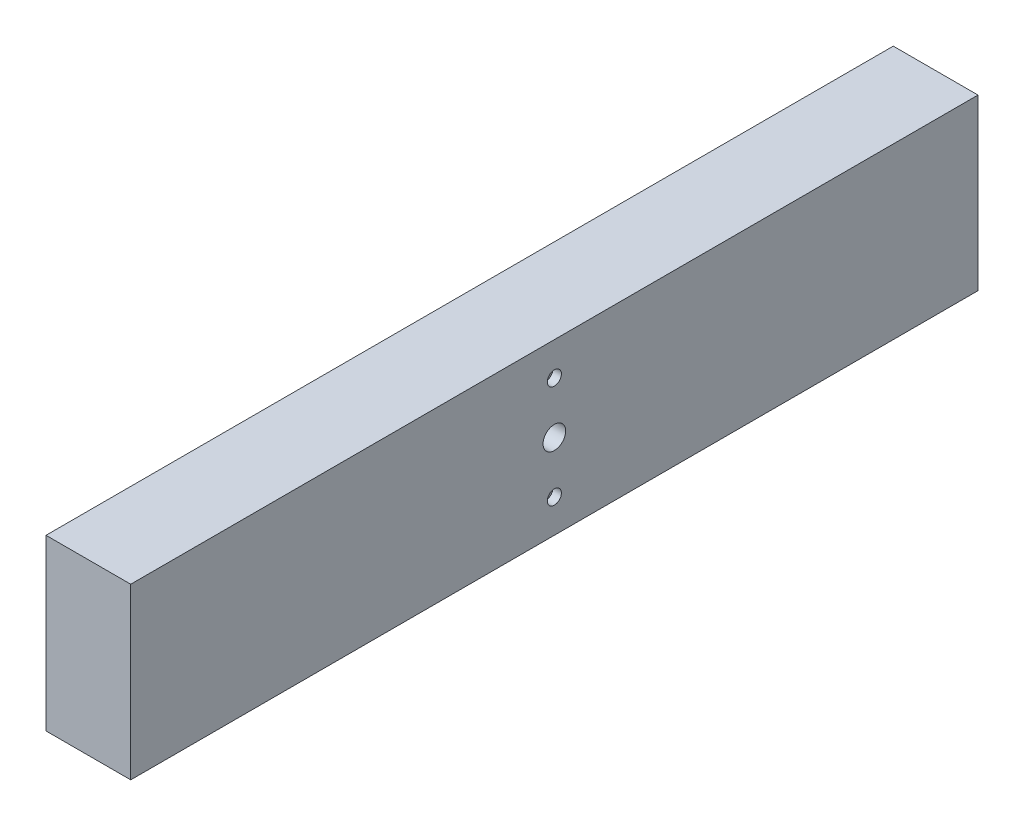
ISO-10303-21;
HEADER;
FILE_DESCRIPTION(('STEP AP214'),'2;1');
FILE_NAME('part.step','',(''),(''),'','','');
FILE_SCHEMA(('AUTOMOTIVE_DESIGN { 1 0 10303 214 1 1 1 1 }'));
ENDSEC;
DATA;
#1=APPLICATION_CONTEXT('core data for automotive mechanical design processes');
#2=APPLICATION_PROTOCOL_DEFINITION('international standard','automotive_design',2000,#1);
#3=PRODUCT_CONTEXT('',#1,'mechanical');
#4=PRODUCT('Part','Part','',(#3));
#5=PRODUCT_RELATED_PRODUCT_CATEGORY('part','',(#4));
#6=PRODUCT_DEFINITION_FORMATION('','',#4);
#7=PRODUCT_DEFINITION_CONTEXT('part definition',#1,'design');
#8=PRODUCT_DEFINITION('design','',#6,#7);
#9=PRODUCT_DEFINITION_SHAPE('','',#8);
#10=(LENGTH_UNIT() NAMED_UNIT(*) SI_UNIT(.MILLI.,.METRE.));
#11=(NAMED_UNIT(*) PLANE_ANGLE_UNIT() SI_UNIT($,.RADIAN.));
#12=(NAMED_UNIT(*) SI_UNIT($,.STERADIAN.) SOLID_ANGLE_UNIT());
#13=UNCERTAINTY_MEASURE_WITH_UNIT(LENGTH_MEASURE(1.E-05),#10,'distance_accuracy_value','');
#14=(GEOMETRIC_REPRESENTATION_CONTEXT(3) GLOBAL_UNCERTAINTY_ASSIGNED_CONTEXT((#13)) GLOBAL_UNIT_ASSIGNED_CONTEXT((#10,
#11,#12)) REPRESENTATION_CONTEXT('',''));
#15=CARTESIAN_POINT('',(0.,0.,0.));
#16=DIRECTION('',(0.,0.,1.));
#17=DIRECTION('',(1.,0.,0.));
#18=AXIS2_PLACEMENT_3D('',#15,#16,#17);
#19=CARTESIAN_POINT('',(15.,-30.,-150.));
#20=DIRECTION('',(1.,0.,0.));
#21=DIRECTION('',(0.,0.,-1.));
#22=AXIS2_PLACEMENT_3D('',#19,#20,#21);
#23=PLANE('',#22);
#24=CARTESIAN_POINT('',(15.,0.,0.));
#25=DIRECTION('',(1.,0.,0.));
#26=DIRECTION('',(0.,0.,-1.));
#27=AXIS2_PLACEMENT_3D('',#24,#25,#26);
#28=CIRCLE('',#27,3.99999999999999);
#29=CARTESIAN_POINT('',(15.,0.,-3.99999999999999));
#30=VERTEX_POINT('',#29);
#31=EDGE_CURVE('E151',#30,#30,#28,.T.);
#32=ORIENTED_EDGE('',*,*,#31,.F.);
#33=EDGE_LOOP('',(#32));
#34=FACE_BOUND('',#33,.T.);
#35=CARTESIAN_POINT('',(15.,18.25,0.));
#36=DIRECTION('',(1.,0.,0.));
#37=DIRECTION('',(0.,0.,-1.));
#38=AXIS2_PLACEMENT_3D('',#35,#36,#37);
#39=CIRCLE('',#38,2.5);
#40=CARTESIAN_POINT('',(15.,18.25,-2.5));
#41=VERTEX_POINT('',#40);
#42=EDGE_CURVE('E105',#41,#41,#39,.T.);
#43=ORIENTED_EDGE('',*,*,#42,.F.);
#44=EDGE_LOOP('',(#43));
#45=FACE_BOUND('',#44,.T.);
#46=CARTESIAN_POINT('',(15.,-18.25,0.));
#47=DIRECTION('',(1.,0.,0.));
#48=DIRECTION('',(0.,0.,1.));
#49=AXIS2_PLACEMENT_3D('',#46,#47,#48);
#50=CIRCLE('',#49,2.5);
#51=CARTESIAN_POINT('',(15.,-18.25,2.5));
#52=VERTEX_POINT('',#51);
#53=EDGE_CURVE('E108',#52,#52,#50,.T.);
#54=ORIENTED_EDGE('',*,*,#53,.F.);
#55=EDGE_LOOP('',(#54));
#56=FACE_BOUND('',#55,.T.);
#57=DIRECTION('',(0.,0.,1.));
#58=VECTOR('',#57,1.);
#59=CARTESIAN_POINT('',(15.,30.,-150.));
#60=LINE('',#59,#58);
#61=CARTESIAN_POINT('',(15.,30.,-150.));
#62=VERTEX_POINT('',#61);
#63=CARTESIAN_POINT('',(15.,30.,150.));
#64=VERTEX_POINT('',#63);
#65=EDGE_CURVE('E42',#62,#64,#60,.T.);
#66=ORIENTED_EDGE('',*,*,#65,.T.);
#67=DIRECTION('',(0.,1.,0.));
#68=VECTOR('',#67,1.);
#69=CARTESIAN_POINT('',(15.,-30.,150.));
#70=LINE('',#69,#68);
#71=CARTESIAN_POINT('',(15.,-30.,150.));
#72=VERTEX_POINT('',#71);
#73=EDGE_CURVE('E80',#72,#64,#70,.T.);
#74=ORIENTED_EDGE('',*,*,#73,.F.);
#75=DIRECTION('',(0.,0.,1.));
#76=VECTOR('',#75,1.);
#77=CARTESIAN_POINT('',(15.,-30.,-150.));
#78=LINE('',#77,#76);
#79=CARTESIAN_POINT('',(15.,-30.,-150.));
#80=VERTEX_POINT('',#79);
#81=EDGE_CURVE('E11',#80,#72,#78,.T.);
#82=ORIENTED_EDGE('',*,*,#81,.F.);
#83=DIRECTION('',(0.,1.,0.));
#84=VECTOR('',#83,1.);
#85=CARTESIAN_POINT('',(15.,-30.,-150.));
#86=LINE('',#85,#84);
#87=EDGE_CURVE('E81',#80,#62,#86,.T.);
#88=ORIENTED_EDGE('',*,*,#87,.T.);
#89=EDGE_LOOP('',(#66,#74,#82,#88));
#90=FACE_BOUND('',#89,.T.);
#91=ADVANCED_FACE('F39',(#34,#45,#56,#90),#23,.T.);
#92=CARTESIAN_POINT('',(-15.,-30.,-150.));
#93=DIRECTION('',(0.,-1.,0.));
#94=DIRECTION('',(0.,0.,-1.));
#95=AXIS2_PLACEMENT_3D('',#92,#93,#94);
#96=PLANE('',#95);
#97=ORIENTED_EDGE('',*,*,#81,.T.);
#98=DIRECTION('',(1.,0.,0.));
#99=VECTOR('',#98,1.);
#100=CARTESIAN_POINT('',(-15.,-30.,150.));
#101=LINE('',#100,#99);
#102=CARTESIAN_POINT('',(-15.,-30.,150.));
#103=VERTEX_POINT('',#102);
#104=EDGE_CURVE('E99',#103,#72,#101,.T.);
#105=ORIENTED_EDGE('',*,*,#104,.F.);
#106=DIRECTION('',(0.,0.,1.));
#107=VECTOR('',#106,1.);
#108=CARTESIAN_POINT('',(-15.,-30.,-150.));
#109=LINE('',#108,#107);
#110=CARTESIAN_POINT('',(-15.,-30.,-150.));
#111=VERTEX_POINT('',#110);
#112=EDGE_CURVE('E48',#111,#103,#109,.T.);
#113=ORIENTED_EDGE('',*,*,#112,.F.);
#114=DIRECTION('',(1.,0.,0.));
#115=VECTOR('',#114,1.);
#116=CARTESIAN_POINT('',(-15.,-30.,-150.));
#117=LINE('',#116,#115);
#118=EDGE_CURVE('E87',#111,#80,#117,.T.);
#119=ORIENTED_EDGE('',*,*,#118,.T.);
#120=EDGE_LOOP('',(#97,#105,#113,#119));
#121=FACE_BOUND('',#120,.T.);
#122=ADVANCED_FACE('F131',(#121),#96,.T.);
#123=CARTESIAN_POINT('',(-15.,-30.,-150.));
#124=DIRECTION('',(-1.,0.,0.));
#125=DIRECTION('',(0.,0.,1.));
#126=AXIS2_PLACEMENT_3D('',#123,#124,#125);
#127=PLANE('',#126);
#128=CARTESIAN_POINT('',(-15.,0.,0.));
#129=DIRECTION('',(1.,0.,0.));
#130=DIRECTION('',(0.,0.,-1.));
#131=AXIS2_PLACEMENT_3D('',#128,#129,#130);
#132=CIRCLE('',#131,3.99999999999999);
#133=CARTESIAN_POINT('',(-15.,0.,-3.99999999999999));
#134=VERTEX_POINT('',#133);
#135=EDGE_CURVE('E160',#134,#134,#132,.T.);
#136=ORIENTED_EDGE('',*,*,#135,.T.);
#137=EDGE_LOOP('',(#136));
#138=FACE_BOUND('',#137,.T.);
#139=ORIENTED_EDGE('',*,*,#112,.T.);
#140=DIRECTION('',(0.,-1.,0.));
#141=VECTOR('',#140,1.);
#142=CARTESIAN_POINT('',(-15.,-30.,150.));
#143=LINE('',#142,#141);
#144=CARTESIAN_POINT('',(-15.,30.,150.));
#145=VERTEX_POINT('',#144);
#146=EDGE_CURVE('E95',#145,#103,#143,.T.);
#147=ORIENTED_EDGE('',*,*,#146,.F.);
#148=DIRECTION('',(0.,0.,1.));
#149=VECTOR('',#148,1.);
#150=CARTESIAN_POINT('',(-15.,30.,-150.));
#151=LINE('',#150,#149);
#152=CARTESIAN_POINT('',(-15.,30.,-150.));
#153=VERTEX_POINT('',#152);
#154=EDGE_CURVE('E86',#153,#145,#151,.T.);
#155=ORIENTED_EDGE('',*,*,#154,.F.);
#156=DIRECTION('',(0.,-1.,0.));
#157=VECTOR('',#156,1.);
#158=CARTESIAN_POINT('',(-15.,-30.,-150.));
#159=LINE('',#158,#157);
#160=EDGE_CURVE('E120',#153,#111,#159,.T.);
#161=ORIENTED_EDGE('',*,*,#160,.T.);
#162=EDGE_LOOP('',(#139,#147,#155,#161));
#163=FACE_BOUND('',#162,.T.);
#164=ADVANCED_FACE('F128',(#138,#163),#127,.T.);
#165=CARTESIAN_POINT('',(-15.,30.,-150.));
#166=DIRECTION('',(0.,1.,0.));
#167=DIRECTION('',(0.,0.,1.));
#168=AXIS2_PLACEMENT_3D('',#165,#166,#167);
#169=PLANE('',#168);
#170=ORIENTED_EDGE('',*,*,#154,.T.);
#171=DIRECTION('',(-1.,0.,0.));
#172=VECTOR('',#171,1.);
#173=CARTESIAN_POINT('',(-15.,30.,150.));
#174=LINE('',#173,#172);
#175=EDGE_CURVE('E89',#64,#145,#174,.T.);
#176=ORIENTED_EDGE('',*,*,#175,.F.);
#177=ORIENTED_EDGE('',*,*,#65,.F.);
#178=DIRECTION('',(-1.,0.,0.));
#179=VECTOR('',#178,1.);
#180=CARTESIAN_POINT('',(-15.,30.,-150.));
#181=LINE('',#180,#179);
#182=EDGE_CURVE('E117',#62,#153,#181,.T.);
#183=ORIENTED_EDGE('',*,*,#182,.T.);
#184=EDGE_LOOP('',(#170,#176,#177,#183));
#185=FACE_BOUND('',#184,.T.);
#186=ADVANCED_FACE('F90',(#185),#169,.T.);
#187=CARTESIAN_POINT('',(0.,0.,-150.));
#188=DIRECTION('',(0.,0.,-1.));
#189=DIRECTION('',(-1.,0.,0.));
#190=AXIS2_PLACEMENT_3D('',#187,#188,#189);
#191=PLANE('',#190);
#192=ORIENTED_EDGE('',*,*,#87,.F.);
#193=ORIENTED_EDGE('',*,*,#118,.F.);
#194=ORIENTED_EDGE('',*,*,#160,.F.);
#195=ORIENTED_EDGE('',*,*,#182,.F.);
#196=EDGE_LOOP('',(#192,#193,#194,#195));
#197=FACE_BOUND('',#196,.T.);
#198=ADVANCED_FACE('F133',(#197),#191,.T.);
#199=CARTESIAN_POINT('',(0.,0.,150.));
#200=DIRECTION('',(0.,0.,-1.));
#201=DIRECTION('',(-1.,0.,0.));
#202=AXIS2_PLACEMENT_3D('',#199,#200,#201);
#203=PLANE('',#202);
#204=ORIENTED_EDGE('',*,*,#73,.T.);
#205=ORIENTED_EDGE('',*,*,#175,.T.);
#206=ORIENTED_EDGE('',*,*,#146,.T.);
#207=ORIENTED_EDGE('',*,*,#104,.T.);
#208=EDGE_LOOP('',(#204,#205,#206,#207));
#209=FACE_BOUND('',#208,.T.);
#210=ADVANCED_FACE('F98',(#209),#203,.F.);
#211=CARTESIAN_POINT('',(12.,-18.25,0.));
#212=DIRECTION('',(1.,0.,0.));
#213=DIRECTION('',(0.,0.,-1.));
#214=AXIS2_PLACEMENT_3D('',#211,#212,#213);
#215=CYLINDRICAL_SURFACE('',#214,2.5);
#216=CARTESIAN_POINT('',(12.,-18.25,0.));
#217=DIRECTION('',(1.,0.,0.));
#218=DIRECTION('',(0.,0.,1.));
#219=AXIS2_PLACEMENT_3D('',#216,#217,#218);
#220=CIRCLE('',#219,2.5);
#221=CARTESIAN_POINT('',(12.,-18.25,2.5));
#222=VERTEX_POINT('',#221);
#223=EDGE_CURVE('E159',#222,#222,#220,.T.);
#224=ORIENTED_EDGE('',*,*,#223,.F.);
#225=EDGE_LOOP('',(#224));
#226=FACE_BOUND('',#225,.T.);
#227=ORIENTED_EDGE('',*,*,#53,.T.);
#228=EDGE_LOOP('',(#227));
#229=FACE_BOUND('',#228,.T.);
#230=ADVANCED_FACE('F140',(#226,#229),#215,.F.);
#231=CARTESIAN_POINT('',(12.,-18.25,0.));
#232=DIRECTION('',(-1.,0.,0.));
#233=DIRECTION('',(0.,0.,1.));
#234=AXIS2_PLACEMENT_3D('',#231,#232,#233);
#235=PLANE('',#234);
#236=ORIENTED_EDGE('',*,*,#223,.T.);
#237=EDGE_LOOP('',(#236));
#238=FACE_BOUND('',#237,.T.);
#239=ADVANCED_FACE('F176',(#238),#235,.F.);
#240=CARTESIAN_POINT('',(12.,18.25,0.));
#241=DIRECTION('',(1.,0.,0.));
#242=DIRECTION('',(0.,0.,-1.));
#243=AXIS2_PLACEMENT_3D('',#240,#241,#242);
#244=CYLINDRICAL_SURFACE('',#243,2.5);
#245=CARTESIAN_POINT('',(12.,18.25,0.));
#246=DIRECTION('',(1.,0.,0.));
#247=DIRECTION('',(0.,0.,-1.));
#248=AXIS2_PLACEMENT_3D('',#245,#246,#247);
#249=CIRCLE('',#248,2.5);
#250=CARTESIAN_POINT('',(12.,18.25,-2.5));
#251=VERTEX_POINT('',#250);
#252=EDGE_CURVE('E101',#251,#251,#249,.T.);
#253=ORIENTED_EDGE('',*,*,#252,.F.);
#254=EDGE_LOOP('',(#253));
#255=FACE_BOUND('',#254,.T.);
#256=ORIENTED_EDGE('',*,*,#42,.T.);
#257=EDGE_LOOP('',(#256));
#258=FACE_BOUND('',#257,.T.);
#259=ADVANCED_FACE('F173',(#255,#258),#244,.F.);
#260=CARTESIAN_POINT('',(12.,18.25,0.));
#261=DIRECTION('',(1.,0.,0.));
#262=DIRECTION('',(0.,0.,-1.));
#263=AXIS2_PLACEMENT_3D('',#260,#261,#262);
#264=PLANE('',#263);
#265=ORIENTED_EDGE('',*,*,#252,.T.);
#266=EDGE_LOOP('',(#265));
#267=FACE_BOUND('',#266,.T.);
#268=ADVANCED_FACE('F175',(#267),#264,.T.);
#269=CARTESIAN_POINT('',(-15.,0.,0.));
#270=DIRECTION('',(1.,0.,0.));
#271=DIRECTION('',(0.,0.,-1.));
#272=AXIS2_PLACEMENT_3D('',#269,#270,#271);
#273=CYLINDRICAL_SURFACE('',#272,3.99999999999999);
#274=ORIENTED_EDGE('',*,*,#135,.F.);
#275=EDGE_LOOP('',(#274));
#276=FACE_BOUND('',#275,.T.);
#277=ORIENTED_EDGE('',*,*,#31,.T.);
#278=EDGE_LOOP('',(#277));
#279=FACE_BOUND('',#278,.T.);
#280=ADVANCED_FACE('F183',(#276,#279),#273,.F.);
#281=CLOSED_SHELL('',(#91,#122,#164,#186,#198,#210,#230,#239,#259,#268,#280));
#282=MANIFOLD_SOLID_BREP('B2',#281);
#283=ADVANCED_BREP_SHAPE_REPRESENTATION('',(#18,#282),#14);
#284=SHAPE_DEFINITION_REPRESENTATION(#9,#283);
ENDSEC;
END-ISO-10303-21;
